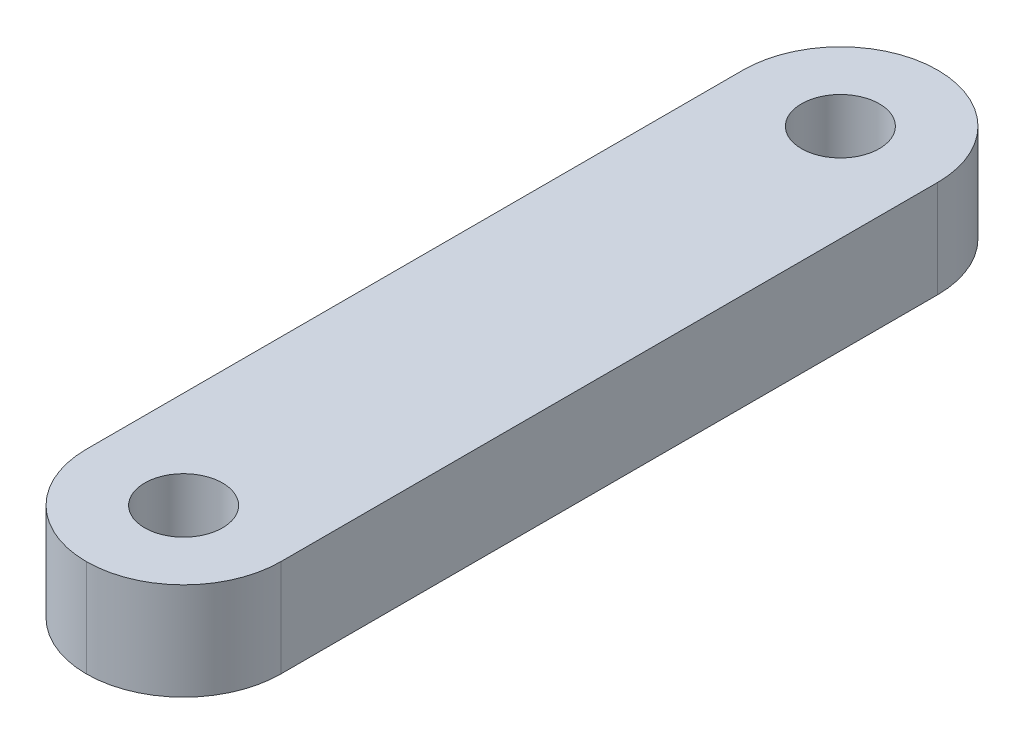
ISO-10303-21;
HEADER;
FILE_DESCRIPTION(('STEP AP214'),'2;1');
FILE_NAME('part.step','',(''),(''),'','','');
FILE_SCHEMA(('AUTOMOTIVE_DESIGN { 1 0 10303 214 1 1 1 1 }'));
ENDSEC;
DATA;
#1=APPLICATION_CONTEXT('core data for automotive mechanical design processes');
#2=APPLICATION_PROTOCOL_DEFINITION('international standard','automotive_design',2000,#1);
#3=PRODUCT_CONTEXT('',#1,'mechanical');
#4=PRODUCT('Part','Part','',(#3));
#5=PRODUCT_RELATED_PRODUCT_CATEGORY('part','',(#4));
#6=PRODUCT_DEFINITION_FORMATION('','',#4);
#7=PRODUCT_DEFINITION_CONTEXT('part definition',#1,'design');
#8=PRODUCT_DEFINITION('design','',#6,#7);
#9=PRODUCT_DEFINITION_SHAPE('','',#8);
#10=(LENGTH_UNIT() NAMED_UNIT(*) SI_UNIT(.MILLI.,.METRE.));
#11=(NAMED_UNIT(*) PLANE_ANGLE_UNIT() SI_UNIT($,.RADIAN.));
#12=(NAMED_UNIT(*) SI_UNIT($,.STERADIAN.) SOLID_ANGLE_UNIT());
#13=UNCERTAINTY_MEASURE_WITH_UNIT(LENGTH_MEASURE(1.E-05),#10,'distance_accuracy_value','');
#14=(GEOMETRIC_REPRESENTATION_CONTEXT(3) GLOBAL_UNCERTAINTY_ASSIGNED_CONTEXT((#13)) GLOBAL_UNIT_ASSIGNED_CONTEXT((#10,
#11,#12)) REPRESENTATION_CONTEXT('',''));
#15=CARTESIAN_POINT('',(0.,0.,0.));
#16=DIRECTION('',(0.,0.,1.));
#17=DIRECTION('',(1.,0.,0.));
#18=AXIS2_PLACEMENT_3D('',#15,#16,#17);
#19=CARTESIAN_POINT('',(0.,0.,35.));
#20=DIRECTION('',(1.,0.,0.));
#21=DIRECTION('',(0.,1.,0.));
#22=AXIS2_PLACEMENT_3D('',#19,#20,#21);
#23=PLANE('',#22);
#24=DIRECTION('',(0.,0.,-1.));
#25=VECTOR('',#24,1.);
#26=CARTESIAN_POINT('',(0.,0.,35.));
#27=LINE('',#26,#25);
#28=CARTESIAN_POINT('',(0.,0.,31.));
#29=VERTEX_POINT('',#28);
#30=CARTESIAN_POINT('',(0.,0.,4.));
#31=VERTEX_POINT('',#30);
#32=EDGE_CURVE('E140',#29,#31,#27,.T.);
#33=ORIENTED_EDGE('',*,*,#32,.T.);
#34=DIRECTION('',(0.,-1.,0.));
#35=VECTOR('',#34,1.);
#36=CARTESIAN_POINT('',(0.,0.,4.));
#37=LINE('',#36,#35);
#38=CARTESIAN_POINT('',(0.,-4.,4.));
#39=VERTEX_POINT('',#38);
#40=EDGE_CURVE('E107',#31,#39,#37,.T.);
#41=ORIENTED_EDGE('',*,*,#40,.T.);
#42=DIRECTION('',(0.,0.,-1.));
#43=VECTOR('',#42,1.);
#44=CARTESIAN_POINT('',(0.,-4.,35.));
#45=LINE('',#44,#43);
#46=CARTESIAN_POINT('',(0.,-4.,31.));
#47=VERTEX_POINT('',#46);
#48=EDGE_CURVE('E90',#47,#39,#45,.T.);
#49=ORIENTED_EDGE('',*,*,#48,.F.);
#50=DIRECTION('',(0.,-1.,0.));
#51=VECTOR('',#50,1.);
#52=CARTESIAN_POINT('',(0.,0.,31.));
#53=LINE('',#52,#51);
#54=EDGE_CURVE('E104',#47,#29,#53,.F.);
#55=ORIENTED_EDGE('',*,*,#54,.T.);
#56=EDGE_LOOP('',(#33,#41,#49,#55));
#57=FACE_BOUND('',#56,.T.);
#58=ADVANCED_FACE('F33',(#57),#23,.F.);
#59=CARTESIAN_POINT('',(0.,-4.,35.));
#60=DIRECTION('',(0.,1.,0.));
#61=DIRECTION('',(0.,0.,1.));
#62=AXIS2_PLACEMENT_3D('',#59,#60,#61);
#63=PLANE('',#62);
#64=CARTESIAN_POINT('',(4.,-4.,31.));
#65=DIRECTION('',(0.,1.,0.));
#66=DIRECTION('',(0.,0.,1.));
#67=AXIS2_PLACEMENT_3D('',#64,#65,#66);
#68=CIRCLE('',#67,1.59999999999997);
#69=CARTESIAN_POINT('',(4.,-4.,32.6));
#70=VERTEX_POINT('',#69);
#71=EDGE_CURVE('E133',#70,#70,#68,.T.);
#72=ORIENTED_EDGE('',*,*,#71,.T.);
#73=EDGE_LOOP('',(#72));
#74=FACE_BOUND('',#73,.T.);
#75=CARTESIAN_POINT('',(4.,-4.,4.));
#76=DIRECTION('',(0.,1.,0.));
#77=DIRECTION('',(0.,0.,1.));
#78=AXIS2_PLACEMENT_3D('',#75,#76,#77);
#79=CIRCLE('',#78,1.6);
#80=CARTESIAN_POINT('',(4.,-4.,5.6));
#81=VERTEX_POINT('',#80);
#82=EDGE_CURVE('E144',#81,#81,#79,.T.);
#83=ORIENTED_EDGE('',*,*,#82,.T.);
#84=EDGE_LOOP('',(#83));
#85=FACE_BOUND('',#84,.T.);
#86=ORIENTED_EDGE('',*,*,#48,.T.);
#87=CARTESIAN_POINT('',(4.,-4.,4.));
#88=DIRECTION('',(0.,1.,0.));
#89=DIRECTION('',(0.,0.,1.));
#90=AXIS2_PLACEMENT_3D('',#87,#88,#89);
#91=CIRCLE('',#90,4.);
#92=CARTESIAN_POINT('',(4.,-4.,0.));
#93=VERTEX_POINT('',#92);
#94=EDGE_CURVE('E118',#39,#93,#91,.F.);
#95=ORIENTED_EDGE('',*,*,#94,.T.);
#96=CARTESIAN_POINT('',(4.,-4.,4.));
#97=DIRECTION('',(0.,1.,0.));
#98=DIRECTION('',(0.,0.,1.));
#99=AXIS2_PLACEMENT_3D('',#96,#97,#98);
#100=CIRCLE('',#99,4.);
#101=CARTESIAN_POINT('',(8.,-4.,4.));
#102=VERTEX_POINT('',#101);
#103=EDGE_CURVE('E98',#93,#102,#100,.F.);
#104=ORIENTED_EDGE('',*,*,#103,.T.);
#105=DIRECTION('',(0.,0.,-1.));
#106=VECTOR('',#105,1.);
#107=CARTESIAN_POINT('',(8.,-4.,35.));
#108=LINE('',#107,#106);
#109=CARTESIAN_POINT('',(8.,-4.,31.));
#110=VERTEX_POINT('',#109);
#111=EDGE_CURVE('E108',#110,#102,#108,.T.);
#112=ORIENTED_EDGE('',*,*,#111,.F.);
#113=CARTESIAN_POINT('',(4.,-4.,31.));
#114=DIRECTION('',(0.,1.,0.));
#115=DIRECTION('',(0.,0.,1.));
#116=AXIS2_PLACEMENT_3D('',#113,#114,#115);
#117=CIRCLE('',#116,4.);
#118=CARTESIAN_POINT('',(4.,-4.,35.));
#119=VERTEX_POINT('',#118);
#120=EDGE_CURVE('E93',#110,#119,#117,.F.);
#121=ORIENTED_EDGE('',*,*,#120,.T.);
#122=CARTESIAN_POINT('',(4.,-4.,31.));
#123=DIRECTION('',(0.,1.,0.));
#124=DIRECTION('',(0.,0.,1.));
#125=AXIS2_PLACEMENT_3D('',#122,#123,#124);
#126=CIRCLE('',#125,4.);
#127=EDGE_CURVE('E87',#119,#47,#126,.F.);
#128=ORIENTED_EDGE('',*,*,#127,.T.);
#129=EDGE_LOOP('',(#86,#95,#104,#112,#121,#128));
#130=FACE_BOUND('',#129,.T.);
#131=ADVANCED_FACE('F89',(#74,#85,#130),#63,.F.);
#132=CARTESIAN_POINT('',(8.,0.,35.));
#133=DIRECTION('',(-1.,0.,0.));
#134=DIRECTION('',(0.,-1.,0.));
#135=AXIS2_PLACEMENT_3D('',#132,#133,#134);
#136=PLANE('',#135);
#137=ORIENTED_EDGE('',*,*,#111,.T.);
#138=DIRECTION('',(0.,1.,0.));
#139=VECTOR('',#138,1.);
#140=CARTESIAN_POINT('',(8.,0.,4.));
#141=LINE('',#140,#139);
#142=CARTESIAN_POINT('',(8.,0.,4.));
#143=VERTEX_POINT('',#142);
#144=EDGE_CURVE('E11',#102,#143,#141,.T.);
#145=ORIENTED_EDGE('',*,*,#144,.T.);
#146=DIRECTION('',(0.,0.,-1.));
#147=VECTOR('',#146,1.);
#148=CARTESIAN_POINT('',(8.,0.,35.));
#149=LINE('',#148,#147);
#150=CARTESIAN_POINT('',(8.,0.,31.));
#151=VERTEX_POINT('',#150);
#152=EDGE_CURVE('E138',#151,#143,#149,.T.);
#153=ORIENTED_EDGE('',*,*,#152,.F.);
#154=DIRECTION('',(0.,1.,0.));
#155=VECTOR('',#154,1.);
#156=CARTESIAN_POINT('',(8.,-4.,31.));
#157=LINE('',#156,#155);
#158=EDGE_CURVE('E42',#151,#110,#157,.F.);
#159=ORIENTED_EDGE('',*,*,#158,.T.);
#160=EDGE_LOOP('',(#137,#145,#153,#159));
#161=FACE_BOUND('',#160,.T.);
#162=ADVANCED_FACE('F137',(#161),#136,.F.);
#163=CARTESIAN_POINT('',(0.,0.,35.));
#164=DIRECTION('',(0.,-1.,0.));
#165=DIRECTION('',(0.,0.,-1.));
#166=AXIS2_PLACEMENT_3D('',#163,#164,#165);
#167=PLANE('',#166);
#168=CARTESIAN_POINT('',(4.,0.,31.));
#169=DIRECTION('',(0.,1.,0.));
#170=DIRECTION('',(0.,0.,1.));
#171=AXIS2_PLACEMENT_3D('',#168,#169,#170);
#172=CIRCLE('',#171,1.59999999999997);
#173=CARTESIAN_POINT('',(4.,0.,32.6));
#174=VERTEX_POINT('',#173);
#175=EDGE_CURVE('E128',#174,#174,#172,.T.);
#176=ORIENTED_EDGE('',*,*,#175,.F.);
#177=EDGE_LOOP('',(#176));
#178=FACE_BOUND('',#177,.T.);
#179=CARTESIAN_POINT('',(4.,0.,4.));
#180=DIRECTION('',(0.,1.,0.));
#181=DIRECTION('',(0.,0.,1.));
#182=AXIS2_PLACEMENT_3D('',#179,#180,#181);
#183=CIRCLE('',#182,1.6);
#184=CARTESIAN_POINT('',(4.,0.,5.6));
#185=VERTEX_POINT('',#184);
#186=EDGE_CURVE('E145',#185,#185,#183,.T.);
#187=ORIENTED_EDGE('',*,*,#186,.F.);
#188=EDGE_LOOP('',(#187));
#189=FACE_BOUND('',#188,.T.);
#190=CARTESIAN_POINT('',(4.,0.,4.));
#191=DIRECTION('',(0.,-1.,0.));
#192=DIRECTION('',(0.,0.,-1.));
#193=AXIS2_PLACEMENT_3D('',#190,#191,#192);
#194=CIRCLE('',#193,4.);
#195=CARTESIAN_POINT('',(4.,0.,0.));
#196=VERTEX_POINT('',#195);
#197=EDGE_CURVE('E122',#143,#196,#194,.F.);
#198=ORIENTED_EDGE('',*,*,#197,.T.);
#199=CARTESIAN_POINT('',(4.,0.,4.));
#200=DIRECTION('',(0.,-1.,0.));
#201=DIRECTION('',(0.,0.,-1.));
#202=AXIS2_PLACEMENT_3D('',#199,#200,#201);
#203=CIRCLE('',#202,4.);
#204=EDGE_CURVE('E124',#196,#31,#203,.F.);
#205=ORIENTED_EDGE('',*,*,#204,.T.);
#206=ORIENTED_EDGE('',*,*,#32,.F.);
#207=CARTESIAN_POINT('',(4.,0.,31.));
#208=DIRECTION('',(0.,-1.,0.));
#209=DIRECTION('',(0.,0.,-1.));
#210=AXIS2_PLACEMENT_3D('',#207,#208,#209);
#211=CIRCLE('',#210,4.);
#212=CARTESIAN_POINT('',(4.,0.,35.));
#213=VERTEX_POINT('',#212);
#214=EDGE_CURVE('E111',#29,#213,#211,.F.);
#215=ORIENTED_EDGE('',*,*,#214,.T.);
#216=CARTESIAN_POINT('',(4.,0.,31.));
#217=DIRECTION('',(0.,-1.,0.));
#218=DIRECTION('',(0.,0.,-1.));
#219=AXIS2_PLACEMENT_3D('',#216,#217,#218);
#220=CIRCLE('',#219,4.);
#221=EDGE_CURVE('E55',#213,#151,#220,.F.);
#222=ORIENTED_EDGE('',*,*,#221,.T.);
#223=ORIENTED_EDGE('',*,*,#152,.T.);
#224=EDGE_LOOP('',(#198,#205,#206,#215,#222,#223));
#225=FACE_BOUND('',#224,.T.);
#226=ADVANCED_FACE('F163',(#178,#189,#225),#167,.F.);
#227=CARTESIAN_POINT('',(4.,-4.,4.));
#228=DIRECTION('',(0.,1.,0.));
#229=DIRECTION('',(0.,0.,1.));
#230=AXIS2_PLACEMENT_3D('',#227,#228,#229);
#231=CYLINDRICAL_SURFACE('',#230,1.6);
#232=ORIENTED_EDGE('',*,*,#82,.F.);
#233=EDGE_LOOP('',(#232));
#234=FACE_BOUND('',#233,.T.);
#235=ORIENTED_EDGE('',*,*,#186,.T.);
#236=EDGE_LOOP('',(#235));
#237=FACE_BOUND('',#236,.T.);
#238=ADVANCED_FACE('F159',(#234,#237),#231,.F.);
#239=CARTESIAN_POINT('',(4.,-4.,31.));
#240=DIRECTION('',(0.,1.,0.));
#241=DIRECTION('',(0.,0.,1.));
#242=AXIS2_PLACEMENT_3D('',#239,#240,#241);
#243=CYLINDRICAL_SURFACE('',#242,1.59999999999997);
#244=ORIENTED_EDGE('',*,*,#71,.F.);
#245=EDGE_LOOP('',(#244));
#246=FACE_BOUND('',#245,.T.);
#247=ORIENTED_EDGE('',*,*,#175,.T.);
#248=EDGE_LOOP('',(#247));
#249=FACE_BOUND('',#248,.T.);
#250=ADVANCED_FACE('F155',(#246,#249),#243,.F.);
#251=CARTESIAN_POINT('',(4.,0.,4.));
#252=DIRECTION('',(0.,1.,0.));
#253=DIRECTION('',(-1.,0.,0.));
#254=AXIS2_PLACEMENT_3D('',#251,#252,#253);
#255=CYLINDRICAL_SURFACE('',#254,4.);
#256=DIRECTION('',(0.,1.,0.));
#257=VECTOR('',#256,1.);
#258=CARTESIAN_POINT('',(4.,0.,0.));
#259=LINE('',#258,#257);
#260=EDGE_CURVE('E126',#196,#93,#259,.F.);
#261=ORIENTED_EDGE('',*,*,#260,.F.);
#262=ORIENTED_EDGE('',*,*,#197,.F.);
#263=ORIENTED_EDGE('',*,*,#144,.F.);
#264=ORIENTED_EDGE('',*,*,#103,.F.);
#265=EDGE_LOOP('',(#261,#262,#263,#264));
#266=FACE_BOUND('',#265,.T.);
#267=ADVANCED_FACE('F158',(#266),#255,.T.);
#268=CARTESIAN_POINT('',(4.,0.,4.));
#269=DIRECTION('',(0.,-1.,0.));
#270=DIRECTION('',(1.,0.,0.));
#271=AXIS2_PLACEMENT_3D('',#268,#269,#270);
#272=CYLINDRICAL_SURFACE('',#271,4.);
#273=ORIENTED_EDGE('',*,*,#204,.F.);
#274=ORIENTED_EDGE('',*,*,#260,.T.);
#275=ORIENTED_EDGE('',*,*,#94,.F.);
#276=ORIENTED_EDGE('',*,*,#40,.F.);
#277=EDGE_LOOP('',(#273,#274,#275,#276));
#278=FACE_BOUND('',#277,.T.);
#279=ADVANCED_FACE('F170',(#278),#272,.T.);
#280=CARTESIAN_POINT('',(4.,0.,31.));
#281=DIRECTION('',(0.,-1.,0.));
#282=DIRECTION('',(1.,0.,0.));
#283=AXIS2_PLACEMENT_3D('',#280,#281,#282);
#284=CYLINDRICAL_SURFACE('',#283,4.);
#285=ORIENTED_EDGE('',*,*,#158,.F.);
#286=ORIENTED_EDGE('',*,*,#221,.F.);
#287=DIRECTION('',(0.,1.,0.));
#288=VECTOR('',#287,1.);
#289=CARTESIAN_POINT('',(4.,0.,35.));
#290=LINE('',#289,#288);
#291=EDGE_CURVE('E37',#119,#213,#290,.T.);
#292=ORIENTED_EDGE('',*,*,#291,.F.);
#293=ORIENTED_EDGE('',*,*,#120,.F.);
#294=EDGE_LOOP('',(#285,#286,#292,#293));
#295=FACE_BOUND('',#294,.T.);
#296=ADVANCED_FACE('F35',(#295),#284,.T.);
#297=CARTESIAN_POINT('',(4.,0.,31.));
#298=DIRECTION('',(0.,1.,0.));
#299=DIRECTION('',(-1.,0.,0.));
#300=AXIS2_PLACEMENT_3D('',#297,#298,#299);
#301=CYLINDRICAL_SURFACE('',#300,4.);
#302=ORIENTED_EDGE('',*,*,#214,.F.);
#303=ORIENTED_EDGE('',*,*,#54,.F.);
#304=ORIENTED_EDGE('',*,*,#127,.F.);
#305=ORIENTED_EDGE('',*,*,#291,.T.);
#306=EDGE_LOOP('',(#302,#303,#304,#305));
#307=FACE_BOUND('',#306,.T.);
#308=ADVANCED_FACE('F110',(#307),#301,.T.);
#309=CLOSED_SHELL('',(#58,#131,#162,#226,#238,#250,#267,#279,#296,#308));
#310=MANIFOLD_SOLID_BREP('B2',#309);
#311=ADVANCED_BREP_SHAPE_REPRESENTATION('',(#18,#310),#14);
#312=SHAPE_DEFINITION_REPRESENTATION(#9,#311);
ENDSEC;
END-ISO-10303-21;
